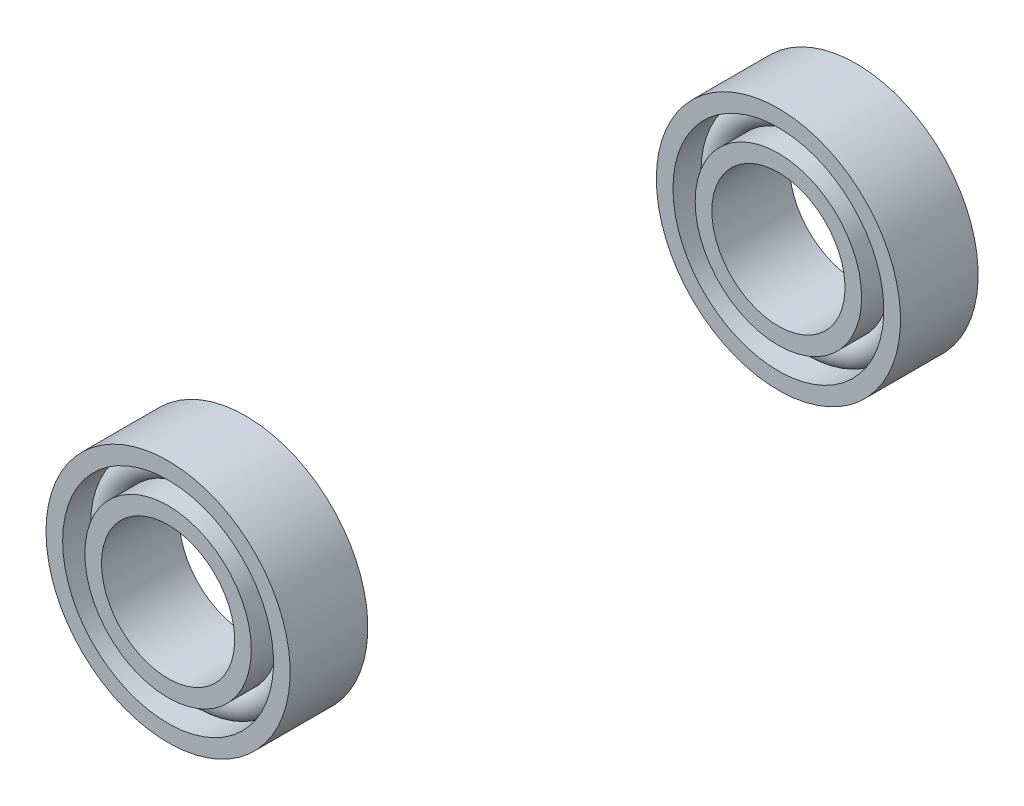
ISO-10303-21;
HEADER;
FILE_DESCRIPTION(('STEP AP214'),'2;1');
FILE_NAME('part.step','',(''),(''),'','','');
FILE_SCHEMA(('AUTOMOTIVE_DESIGN { 1 0 10303 214 1 1 1 1 }'));
ENDSEC;
DATA;
#1=APPLICATION_CONTEXT('core data for automotive mechanical design processes');
#2=APPLICATION_PROTOCOL_DEFINITION('international standard','automotive_design',2000,#1);
#3=PRODUCT_CONTEXT('',#1,'mechanical');
#4=PRODUCT('Part','Part','',(#3));
#5=PRODUCT_RELATED_PRODUCT_CATEGORY('part','',(#4));
#6=PRODUCT_DEFINITION_FORMATION('','',#4);
#7=PRODUCT_DEFINITION_CONTEXT('part definition',#1,'design');
#8=PRODUCT_DEFINITION('design','',#6,#7);
#9=PRODUCT_DEFINITION_SHAPE('','',#8);
#10=(LENGTH_UNIT() NAMED_UNIT(*) SI_UNIT(.MILLI.,.METRE.));
#11=(NAMED_UNIT(*) PLANE_ANGLE_UNIT() SI_UNIT($,.RADIAN.));
#12=(NAMED_UNIT(*) SI_UNIT($,.STERADIAN.) SOLID_ANGLE_UNIT());
#13=UNCERTAINTY_MEASURE_WITH_UNIT(LENGTH_MEASURE(1.E-05),#10,'distance_accuracy_value','');
#14=(GEOMETRIC_REPRESENTATION_CONTEXT(3) GLOBAL_UNCERTAINTY_ASSIGNED_CONTEXT((#13)) GLOBAL_UNIT_ASSIGNED_CONTEXT((#10,
#11,#12)) REPRESENTATION_CONTEXT('',''));
#15=CARTESIAN_POINT('',(0.,0.,0.));
#16=DIRECTION('',(0.,0.,1.));
#17=DIRECTION('',(1.,0.,0.));
#18=AXIS2_PLACEMENT_3D('',#15,#16,#17);
#19=CARTESIAN_POINT('',(172.5,0.,143.));
#20=DIRECTION('',(0.,0.,-1.));
#21=DIRECTION('',(-1.,0.,0.));
#22=AXIS2_PLACEMENT_3D('',#19,#20,#21);
#23=TOROIDAL_SURFACE('',#22,8.50000000000001,1.40000000000001);
#24=CARTESIAN_POINT('',(172.5,0.,142.020204102887));
#25=DIRECTION('',(0.,0.,1.));
#26=DIRECTION('',(1.,0.,0.));
#27=AXIS2_PLACEMENT_3D('',#24,#25,#26);
#28=CIRCLE('',#27,7.50000000000001);
#29=CARTESIAN_POINT('',(180.,0.,142.020204102887));
#30=VERTEX_POINT('',#29);
#31=EDGE_CURVE('E52',#30,#30,#28,.T.);
#32=ORIENTED_EDGE('',*,*,#31,.T.);
#33=EDGE_LOOP('',(#32));
#34=FACE_BOUND('',#33,.T.);
#35=CARTESIAN_POINT('',(172.5,0.,142.020204102887));
#36=DIRECTION('',(0.,0.,1.));
#37=DIRECTION('',(1.,0.,0.));
#38=AXIS2_PLACEMENT_3D('',#35,#36,#37);
#39=CIRCLE('',#38,9.50000000000001);
#40=CARTESIAN_POINT('',(182.,0.,142.020204102887));
#41=VERTEX_POINT('',#40);
#42=EDGE_CURVE('E11',#41,#41,#39,.T.);
#43=ORIENTED_EDGE('',*,*,#42,.F.);
#44=EDGE_LOOP('',(#43));
#45=FACE_BOUND('',#44,.T.);
#46=ADVANCED_FACE('F41',(#34,#45),#23,.T.);
#47=CARTESIAN_POINT('',(172.5,0.,143.979795897113));
#48=DIRECTION('',(0.,0.,-1.));
#49=DIRECTION('',(-1.,0.,0.));
#50=AXIS2_PLACEMENT_3D('',#47,#48,#49);
#51=CIRCLE('',#50,7.50000000000001);
#52=CARTESIAN_POINT('',(165.,0.,143.979795897113));
#53=VERTEX_POINT('',#52);
#54=EDGE_CURVE('E56',#53,#53,#51,.T.);
#55=ORIENTED_EDGE('',*,*,#54,.T.);
#56=EDGE_LOOP('',(#55));
#57=FACE_BOUND('',#56,.T.);
#58=CARTESIAN_POINT('',(172.5,0.,143.979795897113));
#59=DIRECTION('',(0.,0.,-1.));
#60=DIRECTION('',(-1.,0.,0.));
#61=AXIS2_PLACEMENT_3D('',#58,#59,#60);
#62=CIRCLE('',#61,9.50000000000001);
#63=CARTESIAN_POINT('',(163.,0.,143.979795897113));
#64=VERTEX_POINT('',#63);
#65=EDGE_CURVE('E48',#64,#64,#62,.T.);
#66=ORIENTED_EDGE('',*,*,#65,.F.);
#67=EDGE_LOOP('',(#66));
#68=FACE_BOUND('',#67,.T.);
#69=ADVANCED_FACE('F104',(#57,#68),#23,.T.);
#70=CARTESIAN_POINT('',(172.5,0.,134.5));
#71=DIRECTION('',(0.,0.,-1.));
#72=DIRECTION('',(-1.,0.,0.));
#73=AXIS2_PLACEMENT_3D('',#70,#71,#72);
#74=CYLINDRICAL_SURFACE('',#73,7.50000000000001);
#75=CARTESIAN_POINT('',(172.5,0.,139.5));
#76=DIRECTION('',(0.,0.,-1.));
#77=DIRECTION('',(-1.,0.,0.));
#78=AXIS2_PLACEMENT_3D('',#75,#76,#77);
#79=CIRCLE('',#78,7.50000000000001);
#80=CARTESIAN_POINT('',(165.,0.,139.5));
#81=VERTEX_POINT('',#80);
#82=EDGE_CURVE('E64',#81,#81,#79,.T.);
#83=ORIENTED_EDGE('',*,*,#82,.F.);
#84=EDGE_LOOP('',(#83));
#85=FACE_BOUND('',#84,.T.);
#86=ORIENTED_EDGE('',*,*,#31,.F.);
#87=EDGE_LOOP('',(#86));
#88=FACE_BOUND('',#87,.T.);
#89=ADVANCED_FACE('F109',(#85,#88),#74,.T.);
#90=CARTESIAN_POINT('',(172.5,0.,146.5));
#91=DIRECTION('',(0.,0.,-1.));
#92=DIRECTION('',(-1.,0.,0.));
#93=AXIS2_PLACEMENT_3D('',#90,#91,#92);
#94=CIRCLE('',#93,7.50000000000001);
#95=CARTESIAN_POINT('',(165.,0.,146.5));
#96=VERTEX_POINT('',#95);
#97=EDGE_CURVE('E67',#96,#96,#94,.T.);
#98=ORIENTED_EDGE('',*,*,#97,.T.);
#99=EDGE_LOOP('',(#98));
#100=FACE_BOUND('',#99,.T.);
#101=ORIENTED_EDGE('',*,*,#54,.F.);
#102=EDGE_LOOP('',(#101));
#103=FACE_BOUND('',#102,.T.);
#104=ADVANCED_FACE('F118',(#100,#103),#74,.T.);
#105=CARTESIAN_POINT('',(172.5,0.,134.5));
#106=DIRECTION('',(0.,0.,-1.));
#107=DIRECTION('',(-1.,0.,0.));
#108=AXIS2_PLACEMENT_3D('',#105,#106,#107);
#109=CYLINDRICAL_SURFACE('',#108,6.00000000000001);
#110=CARTESIAN_POINT('',(172.5,0.,146.5));
#111=DIRECTION('',(0.,0.,-1.));
#112=DIRECTION('',(-1.,0.,0.));
#113=AXIS2_PLACEMENT_3D('',#110,#111,#112);
#114=CIRCLE('',#113,6.00000000000001);
#115=CARTESIAN_POINT('',(166.5,0.,146.5));
#116=VERTEX_POINT('',#115);
#117=EDGE_CURVE('E70',#116,#116,#114,.T.);
#118=ORIENTED_EDGE('',*,*,#117,.F.);
#119=EDGE_LOOP('',(#118));
#120=FACE_BOUND('',#119,.T.);
#121=CARTESIAN_POINT('',(172.5,0.,139.5));
#122=DIRECTION('',(0.,0.,-1.));
#123=DIRECTION('',(-1.,0.,0.));
#124=AXIS2_PLACEMENT_3D('',#121,#122,#123);
#125=CIRCLE('',#124,6.00000000000001);
#126=CARTESIAN_POINT('',(166.5,0.,139.5));
#127=VERTEX_POINT('',#126);
#128=EDGE_CURVE('E61',#127,#127,#125,.T.);
#129=ORIENTED_EDGE('',*,*,#128,.T.);
#130=EDGE_LOOP('',(#129));
#131=FACE_BOUND('',#130,.T.);
#132=ADVANCED_FACE('F43',(#120,#131),#109,.F.);
#133=CARTESIAN_POINT('',(178.5,0.,139.5));
#134=DIRECTION('',(0.,0.,1.));
#135=DIRECTION('',(1.,0.,0.));
#136=AXIS2_PLACEMENT_3D('',#133,#134,#135);
#137=PLANE('',#136);
#138=ORIENTED_EDGE('',*,*,#128,.F.);
#139=EDGE_LOOP('',(#138));
#140=FACE_BOUND('',#139,.T.);
#141=ORIENTED_EDGE('',*,*,#82,.T.);
#142=EDGE_LOOP('',(#141));
#143=FACE_BOUND('',#142,.T.);
#144=ADVANCED_FACE('F115',(#140,#143),#137,.F.);
#145=CARTESIAN_POINT('',(180.,0.,146.5));
#146=DIRECTION('',(0.,0.,-1.));
#147=DIRECTION('',(-1.,0.,0.));
#148=AXIS2_PLACEMENT_3D('',#145,#146,#147);
#149=PLANE('',#148);
#150=ORIENTED_EDGE('',*,*,#97,.F.);
#151=EDGE_LOOP('',(#150));
#152=FACE_BOUND('',#151,.T.);
#153=ORIENTED_EDGE('',*,*,#117,.T.);
#154=EDGE_LOOP('',(#153));
#155=FACE_BOUND('',#154,.T.);
#156=ADVANCED_FACE('F100',(#152,#155),#149,.F.);
#157=CARTESIAN_POINT('',(172.5,0.,134.5));
#158=DIRECTION('',(0.,0.,-1.));
#159=DIRECTION('',(-1.,0.,0.));
#160=AXIS2_PLACEMENT_3D('',#157,#158,#159);
#161=CYLINDRICAL_SURFACE('',#160,9.50000000000001);
#162=CARTESIAN_POINT('',(172.5,0.,139.5));
#163=DIRECTION('',(0.,0.,-1.));
#164=DIRECTION('',(-1.,0.,0.));
#165=AXIS2_PLACEMENT_3D('',#162,#163,#164);
#166=CIRCLE('',#165,9.50000000000001);
#167=CARTESIAN_POINT('',(163.,0.,139.5));
#168=VERTEX_POINT('',#167);
#169=EDGE_CURVE('E73',#168,#168,#166,.T.);
#170=ORIENTED_EDGE('',*,*,#169,.T.);
#171=EDGE_LOOP('',(#170));
#172=FACE_BOUND('',#171,.T.);
#173=ORIENTED_EDGE('',*,*,#42,.T.);
#174=EDGE_LOOP('',(#173));
#175=FACE_BOUND('',#174,.T.);
#176=ADVANCED_FACE('F91',(#172,#175),#161,.F.);
#177=CARTESIAN_POINT('',(172.5,0.,146.5));
#178=DIRECTION('',(0.,0.,-1.));
#179=DIRECTION('',(-1.,0.,0.));
#180=AXIS2_PLACEMENT_3D('',#177,#178,#179);
#181=CIRCLE('',#180,9.50000000000001);
#182=CARTESIAN_POINT('',(163.,0.,146.5));
#183=VERTEX_POINT('',#182);
#184=EDGE_CURVE('E82',#183,#183,#181,.T.);
#185=ORIENTED_EDGE('',*,*,#184,.F.);
#186=EDGE_LOOP('',(#185));
#187=FACE_BOUND('',#186,.T.);
#188=ORIENTED_EDGE('',*,*,#65,.T.);
#189=EDGE_LOOP('',(#188));
#190=FACE_BOUND('',#189,.T.);
#191=ADVANCED_FACE('F88',(#187,#190),#161,.F.);
#192=CARTESIAN_POINT('',(182.,0.,139.5));
#193=DIRECTION('',(0.,0.,1.));
#194=DIRECTION('',(1.,0.,0.));
#195=AXIS2_PLACEMENT_3D('',#192,#193,#194);
#196=PLANE('',#195);
#197=ORIENTED_EDGE('',*,*,#169,.F.);
#198=EDGE_LOOP('',(#197));
#199=FACE_BOUND('',#198,.T.);
#200=CARTESIAN_POINT('',(172.5,0.,139.5));
#201=DIRECTION('',(0.,0.,-1.));
#202=DIRECTION('',(-1.,0.,0.));
#203=AXIS2_PLACEMENT_3D('',#200,#201,#202);
#204=CIRCLE('',#203,11.);
#205=CARTESIAN_POINT('',(161.5,0.,139.5));
#206=VERTEX_POINT('',#205);
#207=EDGE_CURVE('E76',#206,#206,#204,.T.);
#208=ORIENTED_EDGE('',*,*,#207,.T.);
#209=EDGE_LOOP('',(#208));
#210=FACE_BOUND('',#209,.T.);
#211=ADVANCED_FACE('F90',(#199,#210),#196,.F.);
#212=CARTESIAN_POINT('',(172.5,0.,134.5));
#213=DIRECTION('',(0.,0.,-1.));
#214=DIRECTION('',(-1.,0.,0.));
#215=AXIS2_PLACEMENT_3D('',#212,#213,#214);
#216=CYLINDRICAL_SURFACE('',#215,11.);
#217=ORIENTED_EDGE('',*,*,#207,.F.);
#218=EDGE_LOOP('',(#217));
#219=FACE_BOUND('',#218,.T.);
#220=CARTESIAN_POINT('',(172.5,0.,146.5));
#221=DIRECTION('',(0.,0.,-1.));
#222=DIRECTION('',(-1.,0.,0.));
#223=AXIS2_PLACEMENT_3D('',#220,#221,#222);
#224=CIRCLE('',#223,11.);
#225=CARTESIAN_POINT('',(161.5,0.,146.5));
#226=VERTEX_POINT('',#225);
#227=EDGE_CURVE('E79',#226,#226,#224,.T.);
#228=ORIENTED_EDGE('',*,*,#227,.T.);
#229=EDGE_LOOP('',(#228));
#230=FACE_BOUND('',#229,.T.);
#231=ADVANCED_FACE('F97',(#219,#230),#216,.T.);
#232=CARTESIAN_POINT('',(183.5,0.,146.5));
#233=DIRECTION('',(0.,0.,-1.));
#234=DIRECTION('',(-1.,0.,0.));
#235=AXIS2_PLACEMENT_3D('',#232,#233,#234);
#236=PLANE('',#235);
#237=ORIENTED_EDGE('',*,*,#227,.F.);
#238=EDGE_LOOP('',(#237));
#239=FACE_BOUND('',#238,.T.);
#240=ORIENTED_EDGE('',*,*,#184,.T.);
#241=EDGE_LOOP('',(#240));
#242=FACE_BOUND('',#241,.T.);
#243=ADVANCED_FACE('F86',(#239,#242),#236,.F.);
#244=CLOSED_SHELL('',(#46,#69,#89,#104,#132,#144,#156,#176,#191,#211,#231,#243));
#245=MANIFOLD_SOLID_BREP('B2',#244);
#246=CARTESIAN_POINT('',(172.5,0.,88.));
#247=DIRECTION('',(0.,0.,-1.));
#248=DIRECTION('',(-1.,0.,0.));
#249=AXIS2_PLACEMENT_3D('',#246,#247,#248);
#250=TOROIDAL_SURFACE('',#249,8.50000000000001,1.40000000000001);
#251=CARTESIAN_POINT('',(172.5,0.,87.0202041028867));
#252=DIRECTION('',(0.,0.,1.));
#253=DIRECTION('',(1.,0.,0.));
#254=AXIS2_PLACEMENT_3D('',#251,#252,#253);
#255=CIRCLE('',#254,7.50000000000001);
#256=CARTESIAN_POINT('',(180.,0.,87.0202041028867));
#257=VERTEX_POINT('',#256);
#258=EDGE_CURVE('E231',#257,#257,#255,.T.);
#259=ORIENTED_EDGE('',*,*,#258,.T.);
#260=EDGE_LOOP('',(#259));
#261=FACE_BOUND('',#260,.T.);
#262=CARTESIAN_POINT('',(172.5,0.,87.0202041028867));
#263=DIRECTION('',(0.,0.,1.));
#264=DIRECTION('',(1.,0.,0.));
#265=AXIS2_PLACEMENT_3D('',#262,#263,#264);
#266=CIRCLE('',#265,9.50000000000001);
#267=CARTESIAN_POINT('',(182.,0.,87.0202041028867));
#268=VERTEX_POINT('',#267);
#269=EDGE_CURVE('E40',#268,#268,#266,.T.);
#270=ORIENTED_EDGE('',*,*,#269,.F.);
#271=EDGE_LOOP('',(#270));
#272=FACE_BOUND('',#271,.T.);
#273=ADVANCED_FACE('F220',(#261,#272),#250,.T.);
#274=CARTESIAN_POINT('',(172.5,0.,88.9797958971133));
#275=DIRECTION('',(0.,0.,-1.));
#276=DIRECTION('',(-1.,0.,0.));
#277=AXIS2_PLACEMENT_3D('',#274,#275,#276);
#278=CIRCLE('',#277,7.50000000000001);
#279=CARTESIAN_POINT('',(165.,0.,88.9797958971133));
#280=VERTEX_POINT('',#279);
#281=EDGE_CURVE('E235',#280,#280,#278,.T.);
#282=ORIENTED_EDGE('',*,*,#281,.T.);
#283=EDGE_LOOP('',(#282));
#284=FACE_BOUND('',#283,.T.);
#285=CARTESIAN_POINT('',(172.5,0.,88.9797958971133));
#286=DIRECTION('',(0.,0.,-1.));
#287=DIRECTION('',(-1.,0.,0.));
#288=AXIS2_PLACEMENT_3D('',#285,#286,#287);
#289=CIRCLE('',#288,9.50000000000001);
#290=CARTESIAN_POINT('',(163.,0.,88.9797958971133));
#291=VERTEX_POINT('',#290);
#292=EDGE_CURVE('E227',#291,#291,#289,.T.);
#293=ORIENTED_EDGE('',*,*,#292,.F.);
#294=EDGE_LOOP('',(#293));
#295=FACE_BOUND('',#294,.T.);
#296=ADVANCED_FACE('F283',(#284,#295),#250,.T.);
#297=CARTESIAN_POINT('',(172.5,0.,79.5));
#298=DIRECTION('',(0.,0.,-1.));
#299=DIRECTION('',(-1.,0.,0.));
#300=AXIS2_PLACEMENT_3D('',#297,#298,#299);
#301=CYLINDRICAL_SURFACE('',#300,7.50000000000001);
#302=CARTESIAN_POINT('',(172.5,0.,84.5));
#303=DIRECTION('',(0.,0.,-1.));
#304=DIRECTION('',(-1.,0.,0.));
#305=AXIS2_PLACEMENT_3D('',#302,#303,#304);
#306=CIRCLE('',#305,7.50000000000001);
#307=CARTESIAN_POINT('',(165.,0.,84.5));
#308=VERTEX_POINT('',#307);
#309=EDGE_CURVE('E243',#308,#308,#306,.T.);
#310=ORIENTED_EDGE('',*,*,#309,.F.);
#311=EDGE_LOOP('',(#310));
#312=FACE_BOUND('',#311,.T.);
#313=ORIENTED_EDGE('',*,*,#258,.F.);
#314=EDGE_LOOP('',(#313));
#315=FACE_BOUND('',#314,.T.);
#316=ADVANCED_FACE('F288',(#312,#315),#301,.T.);
#317=CARTESIAN_POINT('',(172.5,0.,91.5));
#318=DIRECTION('',(0.,0.,-1.));
#319=DIRECTION('',(-1.,0.,0.));
#320=AXIS2_PLACEMENT_3D('',#317,#318,#319);
#321=CIRCLE('',#320,7.50000000000001);
#322=CARTESIAN_POINT('',(165.,0.,91.5));
#323=VERTEX_POINT('',#322);
#324=EDGE_CURVE('E246',#323,#323,#321,.T.);
#325=ORIENTED_EDGE('',*,*,#324,.T.);
#326=EDGE_LOOP('',(#325));
#327=FACE_BOUND('',#326,.T.);
#328=ORIENTED_EDGE('',*,*,#281,.F.);
#329=EDGE_LOOP('',(#328));
#330=FACE_BOUND('',#329,.T.);
#331=ADVANCED_FACE('F297',(#327,#330),#301,.T.);
#332=CARTESIAN_POINT('',(172.5,0.,79.5));
#333=DIRECTION('',(0.,0.,-1.));
#334=DIRECTION('',(-1.,0.,0.));
#335=AXIS2_PLACEMENT_3D('',#332,#333,#334);
#336=CYLINDRICAL_SURFACE('',#335,6.00000000000001);
#337=CARTESIAN_POINT('',(172.5,0.,91.5));
#338=DIRECTION('',(0.,0.,-1.));
#339=DIRECTION('',(-1.,0.,0.));
#340=AXIS2_PLACEMENT_3D('',#337,#338,#339);
#341=CIRCLE('',#340,6.00000000000001);
#342=CARTESIAN_POINT('',(166.5,0.,91.5));
#343=VERTEX_POINT('',#342);
#344=EDGE_CURVE('E249',#343,#343,#341,.T.);
#345=ORIENTED_EDGE('',*,*,#344,.F.);
#346=EDGE_LOOP('',(#345));
#347=FACE_BOUND('',#346,.T.);
#348=CARTESIAN_POINT('',(172.5,0.,84.5));
#349=DIRECTION('',(0.,0.,-1.));
#350=DIRECTION('',(-1.,0.,0.));
#351=AXIS2_PLACEMENT_3D('',#348,#349,#350);
#352=CIRCLE('',#351,6.00000000000001);
#353=CARTESIAN_POINT('',(166.5,0.,84.5));
#354=VERTEX_POINT('',#353);
#355=EDGE_CURVE('E240',#354,#354,#352,.T.);
#356=ORIENTED_EDGE('',*,*,#355,.T.);
#357=EDGE_LOOP('',(#356));
#358=FACE_BOUND('',#357,.T.);
#359=ADVANCED_FACE('F222',(#347,#358),#336,.F.);
#360=CARTESIAN_POINT('',(178.5,0.,84.5));
#361=DIRECTION('',(0.,0.,1.));
#362=DIRECTION('',(1.,0.,0.));
#363=AXIS2_PLACEMENT_3D('',#360,#361,#362);
#364=PLANE('',#363);
#365=ORIENTED_EDGE('',*,*,#355,.F.);
#366=EDGE_LOOP('',(#365));
#367=FACE_BOUND('',#366,.T.);
#368=ORIENTED_EDGE('',*,*,#309,.T.);
#369=EDGE_LOOP('',(#368));
#370=FACE_BOUND('',#369,.T.);
#371=ADVANCED_FACE('F294',(#367,#370),#364,.F.);
#372=CARTESIAN_POINT('',(180.,0.,91.5));
#373=DIRECTION('',(0.,0.,-1.));
#374=DIRECTION('',(-1.,0.,0.));
#375=AXIS2_PLACEMENT_3D('',#372,#373,#374);
#376=PLANE('',#375);
#377=ORIENTED_EDGE('',*,*,#324,.F.);
#378=EDGE_LOOP('',(#377));
#379=FACE_BOUND('',#378,.T.);
#380=ORIENTED_EDGE('',*,*,#344,.T.);
#381=EDGE_LOOP('',(#380));
#382=FACE_BOUND('',#381,.T.);
#383=ADVANCED_FACE('F279',(#379,#382),#376,.F.);
#384=CARTESIAN_POINT('',(172.5,0.,79.5));
#385=DIRECTION('',(0.,0.,-1.));
#386=DIRECTION('',(-1.,0.,0.));
#387=AXIS2_PLACEMENT_3D('',#384,#385,#386);
#388=CYLINDRICAL_SURFACE('',#387,9.50000000000001);
#389=CARTESIAN_POINT('',(172.5,0.,84.5));
#390=DIRECTION('',(0.,0.,-1.));
#391=DIRECTION('',(-1.,0.,0.));
#392=AXIS2_PLACEMENT_3D('',#389,#390,#391);
#393=CIRCLE('',#392,9.50000000000001);
#394=CARTESIAN_POINT('',(163.,0.,84.5));
#395=VERTEX_POINT('',#394);
#396=EDGE_CURVE('E252',#395,#395,#393,.T.);
#397=ORIENTED_EDGE('',*,*,#396,.T.);
#398=EDGE_LOOP('',(#397));
#399=FACE_BOUND('',#398,.T.);
#400=ORIENTED_EDGE('',*,*,#269,.T.);
#401=EDGE_LOOP('',(#400));
#402=FACE_BOUND('',#401,.T.);
#403=ADVANCED_FACE('F270',(#399,#402),#388,.F.);
#404=CARTESIAN_POINT('',(172.5,0.,91.5));
#405=DIRECTION('',(0.,0.,-1.));
#406=DIRECTION('',(-1.,0.,0.));
#407=AXIS2_PLACEMENT_3D('',#404,#405,#406);
#408=CIRCLE('',#407,9.50000000000001);
#409=CARTESIAN_POINT('',(163.,0.,91.5));
#410=VERTEX_POINT('',#409);
#411=EDGE_CURVE('E261',#410,#410,#408,.T.);
#412=ORIENTED_EDGE('',*,*,#411,.F.);
#413=EDGE_LOOP('',(#412));
#414=FACE_BOUND('',#413,.T.);
#415=ORIENTED_EDGE('',*,*,#292,.T.);
#416=EDGE_LOOP('',(#415));
#417=FACE_BOUND('',#416,.T.);
#418=ADVANCED_FACE('F267',(#414,#417),#388,.F.);
#419=CARTESIAN_POINT('',(182.,0.,84.5));
#420=DIRECTION('',(0.,0.,1.));
#421=DIRECTION('',(1.,0.,0.));
#422=AXIS2_PLACEMENT_3D('',#419,#420,#421);
#423=PLANE('',#422);
#424=ORIENTED_EDGE('',*,*,#396,.F.);
#425=EDGE_LOOP('',(#424));
#426=FACE_BOUND('',#425,.T.);
#427=CARTESIAN_POINT('',(172.5,0.,84.5));
#428=DIRECTION('',(0.,0.,-1.));
#429=DIRECTION('',(-1.,0.,0.));
#430=AXIS2_PLACEMENT_3D('',#427,#428,#429);
#431=CIRCLE('',#430,11.);
#432=CARTESIAN_POINT('',(161.5,0.,84.5));
#433=VERTEX_POINT('',#432);
#434=EDGE_CURVE('E255',#433,#433,#431,.T.);
#435=ORIENTED_EDGE('',*,*,#434,.T.);
#436=EDGE_LOOP('',(#435));
#437=FACE_BOUND('',#436,.T.);
#438=ADVANCED_FACE('F269',(#426,#437),#423,.F.);
#439=CARTESIAN_POINT('',(172.5,0.,79.5));
#440=DIRECTION('',(0.,0.,-1.));
#441=DIRECTION('',(-1.,0.,0.));
#442=AXIS2_PLACEMENT_3D('',#439,#440,#441);
#443=CYLINDRICAL_SURFACE('',#442,11.);
#444=ORIENTED_EDGE('',*,*,#434,.F.);
#445=EDGE_LOOP('',(#444));
#446=FACE_BOUND('',#445,.T.);
#447=CARTESIAN_POINT('',(172.5,0.,91.5));
#448=DIRECTION('',(0.,0.,-1.));
#449=DIRECTION('',(-1.,0.,0.));
#450=AXIS2_PLACEMENT_3D('',#447,#448,#449);
#451=CIRCLE('',#450,11.);
#452=CARTESIAN_POINT('',(161.5,0.,91.5));
#453=VERTEX_POINT('',#452);
#454=EDGE_CURVE('E258',#453,#453,#451,.T.);
#455=ORIENTED_EDGE('',*,*,#454,.T.);
#456=EDGE_LOOP('',(#455));
#457=FACE_BOUND('',#456,.T.);
#458=ADVANCED_FACE('F276',(#446,#457),#443,.T.);
#459=CARTESIAN_POINT('',(183.5,0.,91.5));
#460=DIRECTION('',(0.,0.,-1.));
#461=DIRECTION('',(-1.,0.,0.));
#462=AXIS2_PLACEMENT_3D('',#459,#460,#461);
#463=PLANE('',#462);
#464=ORIENTED_EDGE('',*,*,#454,.F.);
#465=EDGE_LOOP('',(#464));
#466=FACE_BOUND('',#465,.T.);
#467=ORIENTED_EDGE('',*,*,#411,.T.);
#468=EDGE_LOOP('',(#467));
#469=FACE_BOUND('',#468,.T.);
#470=ADVANCED_FACE('F265',(#466,#469),#463,.F.);
#471=CLOSED_SHELL('',(#273,#296,#316,#331,#359,#371,#383,#403,#418,#438,#458,#470));
#472=MANIFOLD_SOLID_BREP('B6',#471);
#473=ADVANCED_BREP_SHAPE_REPRESENTATION('',(#18,#245,#472),#14);
#474=SHAPE_DEFINITION_REPRESENTATION(#9,#473);
ENDSEC;
END-ISO-10303-21;
